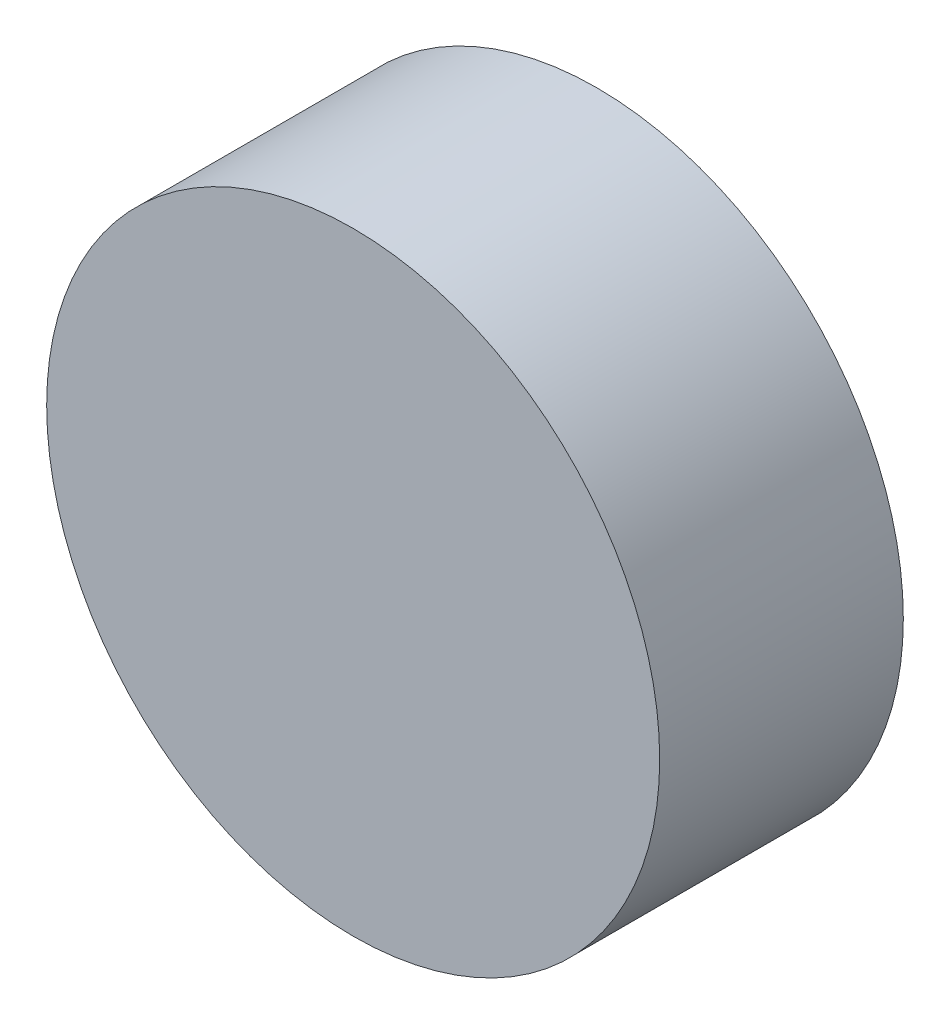
ISO-10303-21;
HEADER;
FILE_DESCRIPTION(('STEP AP214'),'2;1');
FILE_NAME('part.step','',(''),(''),'','','');
FILE_SCHEMA(('AUTOMOTIVE_DESIGN { 1 0 10303 214 1 1 1 1 }'));
ENDSEC;
DATA;
#1=APPLICATION_CONTEXT('core data for automotive mechanical design processes');
#2=APPLICATION_PROTOCOL_DEFINITION('international standard','automotive_design',2000,#1);
#3=PRODUCT_CONTEXT('',#1,'mechanical');
#4=PRODUCT('Part','Part','',(#3));
#5=PRODUCT_RELATED_PRODUCT_CATEGORY('part','',(#4));
#6=PRODUCT_DEFINITION_FORMATION('','',#4);
#7=PRODUCT_DEFINITION_CONTEXT('part definition',#1,'design');
#8=PRODUCT_DEFINITION('design','',#6,#7);
#9=PRODUCT_DEFINITION_SHAPE('','',#8);
#10=(LENGTH_UNIT() NAMED_UNIT(*) SI_UNIT(.MILLI.,.METRE.));
#11=(NAMED_UNIT(*) PLANE_ANGLE_UNIT() SI_UNIT($,.RADIAN.));
#12=(NAMED_UNIT(*) SI_UNIT($,.STERADIAN.) SOLID_ANGLE_UNIT());
#13=UNCERTAINTY_MEASURE_WITH_UNIT(LENGTH_MEASURE(1.E-05),#10,'distance_accuracy_value','');
#14=(GEOMETRIC_REPRESENTATION_CONTEXT(3) GLOBAL_UNCERTAINTY_ASSIGNED_CONTEXT((#13)) GLOBAL_UNIT_ASSIGNED_CONTEXT((#10,
#11,#12)) REPRESENTATION_CONTEXT('',''));
#15=CARTESIAN_POINT('',(0.,0.,0.));
#16=DIRECTION('',(0.,0.,1.));
#17=DIRECTION('',(1.,0.,0.));
#18=AXIS2_PLACEMENT_3D('',#15,#16,#17);
#19=CARTESIAN_POINT('',(0.,0.,23.050246));
#20=DIRECTION('',(0.,0.,-1.));
#21=DIRECTION('',(-1.,0.,0.));
#22=AXIS2_PLACEMENT_3D('',#19,#20,#21);
#23=CYLINDRICAL_SURFACE('',#22,29.);
#24=CARTESIAN_POINT('',(0.,0.,23.050246));
#25=DIRECTION('',(0.,0.,1.));
#26=DIRECTION('',(1.,0.,0.));
#27=AXIS2_PLACEMENT_3D('',#24,#25,#26);
#28=CIRCLE('',#27,29.);
#29=CARTESIAN_POINT('',(29.,0.,23.050246));
#30=VERTEX_POINT('',#29);
#31=EDGE_CURVE('E10',#30,#30,#28,.T.);
#32=ORIENTED_EDGE('',*,*,#31,.F.);
#33=EDGE_LOOP('',(#32));
#34=FACE_BOUND('',#33,.T.);
#35=CARTESIAN_POINT('',(0.,0.,0.));
#36=DIRECTION('',(0.,0.,1.));
#37=DIRECTION('',(1.,0.,0.));
#38=AXIS2_PLACEMENT_3D('',#35,#36,#37);
#39=CIRCLE('',#38,29.);
#40=CARTESIAN_POINT('',(29.,0.,0.));
#41=VERTEX_POINT('',#40);
#42=EDGE_CURVE('E37',#41,#41,#39,.T.);
#43=ORIENTED_EDGE('',*,*,#42,.T.);
#44=EDGE_LOOP('',(#43));
#45=FACE_BOUND('',#44,.T.);
#46=ADVANCED_FACE('F34',(#34,#45),#23,.T.);
#47=CARTESIAN_POINT('',(0.,0.,23.050246));
#48=DIRECTION('',(0.,0.,1.));
#49=DIRECTION('',(1.,0.,0.));
#50=AXIS2_PLACEMENT_3D('',#47,#48,#49);
#51=PLANE('',#50);
#52=ORIENTED_EDGE('',*,*,#31,.T.);
#53=EDGE_LOOP('',(#52));
#54=FACE_BOUND('',#53,.T.);
#55=ADVANCED_FACE('F49',(#54),#51,.T.);
#56=CARTESIAN_POINT('',(0.,0.,0.));
#57=DIRECTION('',(0.,0.,1.));
#58=DIRECTION('',(1.,0.,0.));
#59=AXIS2_PLACEMENT_3D('',#56,#57,#58);
#60=PLANE('',#59);
#61=ORIENTED_EDGE('',*,*,#42,.F.);
#62=EDGE_LOOP('',(#61));
#63=FACE_BOUND('',#62,.T.);
#64=ADVANCED_FACE('F47',(#63),#60,.F.);
#65=CLOSED_SHELL('',(#46,#55,#64));
#66=MANIFOLD_SOLID_BREP('B2',#65);
#67=ADVANCED_BREP_SHAPE_REPRESENTATION('',(#18,#66),#14);
#68=SHAPE_DEFINITION_REPRESENTATION(#9,#67);
ENDSEC;
END-ISO-10303-21;
